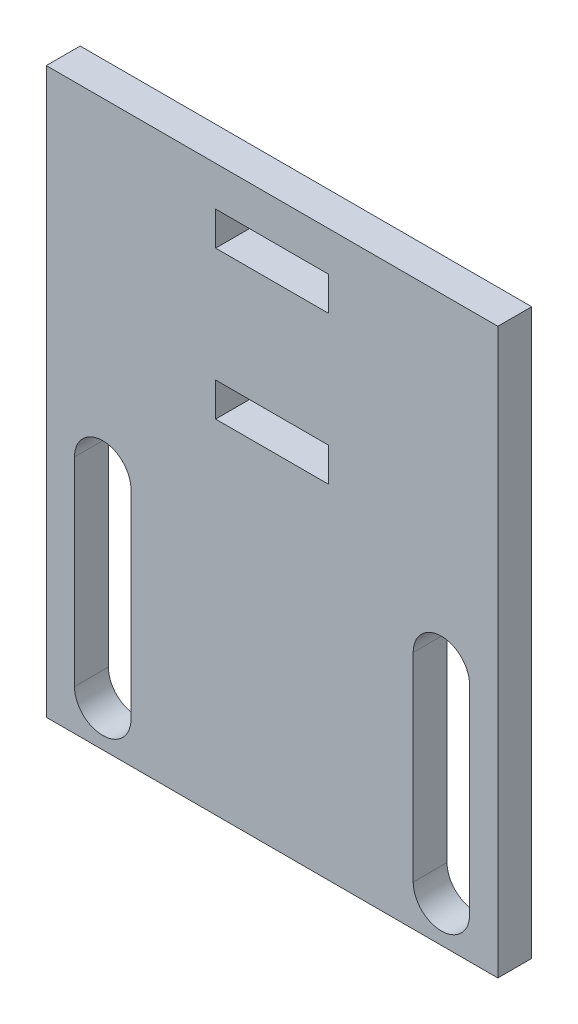
ISO-10303-21;
HEADER;
FILE_DESCRIPTION(('STEP AP214'),'2;1');
FILE_NAME('part.step','',(''),(''),'','','');
FILE_SCHEMA(('AUTOMOTIVE_DESIGN { 1 0 10303 214 1 1 1 1 }'));
ENDSEC;
DATA;
#1=APPLICATION_CONTEXT('core data for automotive mechanical design processes');
#2=APPLICATION_PROTOCOL_DEFINITION('international standard','automotive_design',2000,#1);
#3=PRODUCT_CONTEXT('',#1,'mechanical');
#4=PRODUCT('Part','Part','',(#3));
#5=PRODUCT_RELATED_PRODUCT_CATEGORY('part','',(#4));
#6=PRODUCT_DEFINITION_FORMATION('','',#4);
#7=PRODUCT_DEFINITION_CONTEXT('part definition',#1,'design');
#8=PRODUCT_DEFINITION('design','',#6,#7);
#9=PRODUCT_DEFINITION_SHAPE('','',#8);
#10=(LENGTH_UNIT() NAMED_UNIT(*) SI_UNIT(.MILLI.,.METRE.));
#11=(NAMED_UNIT(*) PLANE_ANGLE_UNIT() SI_UNIT($,.RADIAN.));
#12=(NAMED_UNIT(*) SI_UNIT($,.STERADIAN.) SOLID_ANGLE_UNIT());
#13=UNCERTAINTY_MEASURE_WITH_UNIT(LENGTH_MEASURE(1.E-05),#10,'distance_accuracy_value','');
#14=(GEOMETRIC_REPRESENTATION_CONTEXT(3) GLOBAL_UNCERTAINTY_ASSIGNED_CONTEXT((#13)) GLOBAL_UNIT_ASSIGNED_CONTEXT((#10,
#11,#12)) REPRESENTATION_CONTEXT('',''));
#15=CARTESIAN_POINT('',(0.,0.,0.));
#16=DIRECTION('',(0.,0.,1.));
#17=DIRECTION('',(1.,0.,0.));
#18=AXIS2_PLACEMENT_3D('',#15,#16,#17);
#19=CARTESIAN_POINT('',(0.,0.,3.));
#20=DIRECTION('',(0.,0.,1.));
#21=DIRECTION('',(1.,0.,0.));
#22=AXIS2_PLACEMENT_3D('',#19,#20,#21);
#23=PLANE('',#22);
#24=DIRECTION('',(0.,-1.,0.));
#25=VECTOR('',#24,1.);
#26=CARTESIAN_POINT('',(-20.,-25.,3.));
#27=LINE('',#26,#25);
#28=CARTESIAN_POINT('',(-20.,25.,3.));
#29=VERTEX_POINT('',#28);
#30=CARTESIAN_POINT('',(-20.,-25.,3.));
#31=VERTEX_POINT('',#30);
#32=EDGE_CURVE('E303',#29,#31,#27,.T.);
#33=ORIENTED_EDGE('',*,*,#32,.T.);
#34=DIRECTION('',(1.,0.,0.));
#35=VECTOR('',#34,1.);
#36=CARTESIAN_POINT('',(20.,-25.,3.));
#37=LINE('',#36,#35);
#38=CARTESIAN_POINT('',(20.,-25.,3.));
#39=VERTEX_POINT('',#38);
#40=EDGE_CURVE('E306',#31,#39,#37,.T.);
#41=ORIENTED_EDGE('',*,*,#40,.T.);
#42=DIRECTION('',(0.,1.,0.));
#43=VECTOR('',#42,1.);
#44=CARTESIAN_POINT('',(20.,-25.,3.));
#45=LINE('',#44,#43);
#46=CARTESIAN_POINT('',(20.,25.,3.));
#47=VERTEX_POINT('',#46);
#48=EDGE_CURVE('E309',#39,#47,#45,.T.);
#49=ORIENTED_EDGE('',*,*,#48,.T.);
#50=DIRECTION('',(-1.,0.,0.));
#51=VECTOR('',#50,1.);
#52=CARTESIAN_POINT('',(20.,25.,3.));
#53=LINE('',#52,#51);
#54=EDGE_CURVE('E311',#47,#29,#53,.T.);
#55=ORIENTED_EDGE('',*,*,#54,.T.);
#56=EDGE_LOOP('',(#33,#41,#49,#55));
#57=FACE_BOUND('',#56,.T.);
#58=DIRECTION('',(1.,0.,0.));
#59=VECTOR('',#58,1.);
#60=CARTESIAN_POINT('',(5.,18.4922274745727,3.));
#61=LINE('',#60,#59);
#62=CARTESIAN_POINT('',(-5.,18.4922274745727,3.));
#63=VERTEX_POINT('',#62);
#64=CARTESIAN_POINT('',(5.,18.4922274745727,3.));
#65=VERTEX_POINT('',#64);
#66=EDGE_CURVE('E274',#63,#65,#61,.T.);
#67=ORIENTED_EDGE('',*,*,#66,.F.);
#68=DIRECTION('',(0.,-1.,0.));
#69=VECTOR('',#68,1.);
#70=CARTESIAN_POINT('',(-5.,18.4922274745727,3.));
#71=LINE('',#70,#69);
#72=CARTESIAN_POINT('',(-5.,21.4922274745727,3.));
#73=VERTEX_POINT('',#72);
#74=EDGE_CURVE('E272',#73,#63,#71,.T.);
#75=ORIENTED_EDGE('',*,*,#74,.F.);
#76=DIRECTION('',(-1.,0.,0.));
#77=VECTOR('',#76,1.);
#78=CARTESIAN_POINT('',(5.,21.4922274745727,3.));
#79=LINE('',#78,#77);
#80=CARTESIAN_POINT('',(5.,21.4922274745727,3.));
#81=VERTEX_POINT('',#80);
#82=EDGE_CURVE('E280',#81,#73,#79,.T.);
#83=ORIENTED_EDGE('',*,*,#82,.F.);
#84=DIRECTION('',(0.,1.,0.));
#85=VECTOR('',#84,1.);
#86=CARTESIAN_POINT('',(5.,18.4922274745727,3.));
#87=LINE('',#86,#85);
#88=EDGE_CURVE('E277',#65,#81,#87,.T.);
#89=ORIENTED_EDGE('',*,*,#88,.F.);
#90=EDGE_LOOP('',(#67,#75,#83,#89));
#91=FACE_BOUND('',#90,.T.);
#92=DIRECTION('',(1.,0.,0.));
#93=VECTOR('',#92,1.);
#94=CARTESIAN_POINT('',(5.,5.37805132187915,3.));
#95=LINE('',#94,#93);
#96=CARTESIAN_POINT('',(-5.,5.37805132187915,3.));
#97=VERTEX_POINT('',#96);
#98=CARTESIAN_POINT('',(5.,5.37805132187915,3.));
#99=VERTEX_POINT('',#98);
#100=EDGE_CURVE('E243',#97,#99,#95,.T.);
#101=ORIENTED_EDGE('',*,*,#100,.F.);
#102=DIRECTION('',(0.,-1.,0.));
#103=VECTOR('',#102,1.);
#104=CARTESIAN_POINT('',(-5.,5.37805132187915,3.));
#105=LINE('',#104,#103);
#106=CARTESIAN_POINT('',(-5.,8.37805132187915,3.));
#107=VERTEX_POINT('',#106);
#108=EDGE_CURVE('E241',#107,#97,#105,.T.);
#109=ORIENTED_EDGE('',*,*,#108,.F.);
#110=DIRECTION('',(-1.,0.,0.));
#111=VECTOR('',#110,1.);
#112=CARTESIAN_POINT('',(5.,8.37805132187915,3.));
#113=LINE('',#112,#111);
#114=CARTESIAN_POINT('',(5.,8.37805132187915,3.));
#115=VERTEX_POINT('',#114);
#116=EDGE_CURVE('E249',#115,#107,#113,.T.);
#117=ORIENTED_EDGE('',*,*,#116,.F.);
#118=DIRECTION('',(0.,1.,0.));
#119=VECTOR('',#118,1.);
#120=CARTESIAN_POINT('',(5.,5.37805132187915,3.));
#121=LINE('',#120,#119);
#122=EDGE_CURVE('E246',#99,#115,#121,.T.);
#123=ORIENTED_EDGE('',*,*,#122,.F.);
#124=EDGE_LOOP('',(#101,#109,#117,#123));
#125=FACE_BOUND('',#124,.T.);
#126=DIRECTION('',(0.,-1.,0.));
#127=VECTOR('',#126,1.);
#128=CARTESIAN_POINT('',(12.5,-3.77530240010232,3.));
#129=LINE('',#128,#127);
#130=CARTESIAN_POINT('',(12.5,-3.77530240010232,3.));
#131=VERTEX_POINT('',#130);
#132=CARTESIAN_POINT('',(12.5,-21.3942291070509,3.));
#133=VERTEX_POINT('',#132);
#134=EDGE_CURVE('E212',#131,#133,#129,.T.);
#135=ORIENTED_EDGE('',*,*,#134,.F.);
#136=CARTESIAN_POINT('',(15.,-3.77530240010232,3.));
#137=DIRECTION('',(0.,0.,1.));
#138=DIRECTION('',(-1.,0.,0.));
#139=AXIS2_PLACEMENT_3D('',#136,#137,#138);
#140=CIRCLE('',#139,2.5);
#141=CARTESIAN_POINT('',(17.5,-3.77530240010232,3.));
#142=VERTEX_POINT('',#141);
#143=EDGE_CURVE('E210',#142,#131,#140,.T.);
#144=ORIENTED_EDGE('',*,*,#143,.F.);
#145=DIRECTION('',(0.,1.,0.));
#146=VECTOR('',#145,1.);
#147=CARTESIAN_POINT('',(17.5,-3.77530240010232,3.));
#148=LINE('',#147,#146);
#149=CARTESIAN_POINT('',(17.5,-21.3942291070509,3.));
#150=VERTEX_POINT('',#149);
#151=EDGE_CURVE('E218',#150,#142,#148,.T.);
#152=ORIENTED_EDGE('',*,*,#151,.F.);
#153=CARTESIAN_POINT('',(15.,-21.3942291070509,3.));
#154=DIRECTION('',(0.,0.,1.));
#155=DIRECTION('',(-1.,0.,0.));
#156=AXIS2_PLACEMENT_3D('',#153,#154,#155);
#157=CIRCLE('',#156,2.5);
#158=EDGE_CURVE('E215',#133,#150,#157,.T.);
#159=ORIENTED_EDGE('',*,*,#158,.F.);
#160=EDGE_LOOP('',(#135,#144,#152,#159));
#161=FACE_BOUND('',#160,.T.);
#162=DIRECTION('',(0.,-1.,0.));
#163=VECTOR('',#162,1.);
#164=CARTESIAN_POINT('',(-17.5,-3.77530240010232,3.));
#165=LINE('',#164,#163);
#166=CARTESIAN_POINT('',(-17.5,-3.77530240010232,3.));
#167=VERTEX_POINT('',#166);
#168=CARTESIAN_POINT('',(-17.5,-21.3942291070509,3.));
#169=VERTEX_POINT('',#168);
#170=EDGE_CURVE('E182',#167,#169,#165,.T.);
#171=ORIENTED_EDGE('',*,*,#170,.F.);
#172=CARTESIAN_POINT('',(-15.,-3.77530240010232,3.));
#173=DIRECTION('',(0.,0.,1.));
#174=DIRECTION('',(1.,0.,0.));
#175=AXIS2_PLACEMENT_3D('',#172,#173,#174);
#176=CIRCLE('',#175,2.5);
#177=CARTESIAN_POINT('',(-12.5,-3.77530240010232,3.));
#178=VERTEX_POINT('',#177);
#179=EDGE_CURVE('E174',#178,#167,#176,.T.);
#180=ORIENTED_EDGE('',*,*,#179,.F.);
#181=DIRECTION('',(0.,1.,0.));
#182=VECTOR('',#181,1.);
#183=CARTESIAN_POINT('',(-12.5,-3.77530240010232,3.));
#184=LINE('',#183,#182);
#185=CARTESIAN_POINT('',(-12.5,-21.3942291070509,3.));
#186=VERTEX_POINT('',#185);
#187=EDGE_CURVE('E196',#186,#178,#184,.T.);
#188=ORIENTED_EDGE('',*,*,#187,.F.);
#189=CARTESIAN_POINT('',(-15.,-21.3942291070509,3.));
#190=DIRECTION('',(0.,0.,1.));
#191=DIRECTION('',(1.,0.,0.));
#192=AXIS2_PLACEMENT_3D('',#189,#190,#191);
#193=CIRCLE('',#192,2.5);
#194=EDGE_CURVE('E194',#169,#186,#193,.T.);
#195=ORIENTED_EDGE('',*,*,#194,.F.);
#196=EDGE_LOOP('',(#171,#180,#188,#195));
#197=FACE_BOUND('',#196,.T.);
#198=ADVANCED_FACE('F37',(#57,#91,#125,#161,#197),#23,.T.);
#199=CARTESIAN_POINT('',(0.,0.,0.));
#200=DIRECTION('',(0.,0.,1.));
#201=DIRECTION('',(1.,0.,0.));
#202=AXIS2_PLACEMENT_3D('',#199,#200,#201);
#203=PLANE('',#202);
#204=CARTESIAN_POINT('',(15.,-3.77530240010232,0.));
#205=DIRECTION('',(0.,0.,1.));
#206=DIRECTION('',(-1.,0.,0.));
#207=AXIS2_PLACEMENT_3D('',#204,#205,#206);
#208=CIRCLE('',#207,2.5);
#209=CARTESIAN_POINT('',(17.5,-3.77530240010232,0.));
#210=VERTEX_POINT('',#209);
#211=CARTESIAN_POINT('',(12.5,-3.77530240010232,0.));
#212=VERTEX_POINT('',#211);
#213=EDGE_CURVE('E190',#210,#212,#208,.T.);
#214=ORIENTED_EDGE('',*,*,#213,.T.);
#215=DIRECTION('',(0.,-1.,0.));
#216=VECTOR('',#215,1.);
#217=CARTESIAN_POINT('',(12.5,-3.77530240010232,0.));
#218=LINE('',#217,#216);
#219=CARTESIAN_POINT('',(12.5,-21.3942291070509,0.));
#220=VERTEX_POINT('',#219);
#221=EDGE_CURVE('E223',#212,#220,#218,.T.);
#222=ORIENTED_EDGE('',*,*,#221,.T.);
#223=CARTESIAN_POINT('',(15.,-21.3942291070509,0.));
#224=DIRECTION('',(0.,0.,1.));
#225=DIRECTION('',(-1.,0.,0.));
#226=AXIS2_PLACEMENT_3D('',#223,#224,#225);
#227=CIRCLE('',#226,2.5);
#228=CARTESIAN_POINT('',(17.5,-21.3942291070509,0.));
#229=VERTEX_POINT('',#228);
#230=EDGE_CURVE('E226',#220,#229,#227,.T.);
#231=ORIENTED_EDGE('',*,*,#230,.T.);
#232=DIRECTION('',(0.,1.,0.));
#233=VECTOR('',#232,1.);
#234=CARTESIAN_POINT('',(17.5,-3.77530240010232,0.));
#235=LINE('',#234,#233);
#236=EDGE_CURVE('E213',#229,#210,#235,.T.);
#237=ORIENTED_EDGE('',*,*,#236,.T.);
#238=EDGE_LOOP('',(#214,#222,#231,#237));
#239=FACE_BOUND('',#238,.T.);
#240=DIRECTION('',(0.,-1.,0.));
#241=VECTOR('',#240,1.);
#242=CARTESIAN_POINT('',(-5.,18.4922274745727,0.));
#243=LINE('',#242,#241);
#244=CARTESIAN_POINT('',(-5.,21.4922274745727,0.));
#245=VERTEX_POINT('',#244);
#246=CARTESIAN_POINT('',(-5.,18.4922274745727,0.));
#247=VERTEX_POINT('',#246);
#248=EDGE_CURVE('E271',#245,#247,#243,.T.);
#249=ORIENTED_EDGE('',*,*,#248,.T.);
#250=DIRECTION('',(1.,0.,0.));
#251=VECTOR('',#250,1.);
#252=CARTESIAN_POINT('',(5.,18.4922274745727,0.));
#253=LINE('',#252,#251);
#254=CARTESIAN_POINT('',(5.,18.4922274745727,0.));
#255=VERTEX_POINT('',#254);
#256=EDGE_CURVE('E285',#247,#255,#253,.T.);
#257=ORIENTED_EDGE('',*,*,#256,.T.);
#258=DIRECTION('',(0.,1.,0.));
#259=VECTOR('',#258,1.);
#260=CARTESIAN_POINT('',(5.,18.4922274745727,0.));
#261=LINE('',#260,#259);
#262=CARTESIAN_POINT('',(5.,21.4922274745727,0.));
#263=VERTEX_POINT('',#262);
#264=EDGE_CURVE('E288',#255,#263,#261,.T.);
#265=ORIENTED_EDGE('',*,*,#264,.T.);
#266=DIRECTION('',(-1.,0.,0.));
#267=VECTOR('',#266,1.);
#268=CARTESIAN_POINT('',(5.,21.4922274745727,0.));
#269=LINE('',#268,#267);
#270=EDGE_CURVE('E275',#263,#245,#269,.T.);
#271=ORIENTED_EDGE('',*,*,#270,.T.);
#272=EDGE_LOOP('',(#249,#257,#265,#271));
#273=FACE_BOUND('',#272,.T.);
#274=DIRECTION('',(0.,-1.,0.));
#275=VECTOR('',#274,1.);
#276=CARTESIAN_POINT('',(-20.,-25.,0.));
#277=LINE('',#276,#275);
#278=CARTESIAN_POINT('',(-20.,25.,0.));
#279=VERTEX_POINT('',#278);
#280=CARTESIAN_POINT('',(-20.,-25.,0.));
#281=VERTEX_POINT('',#280);
#282=EDGE_CURVE('E302',#279,#281,#277,.T.);
#283=ORIENTED_EDGE('',*,*,#282,.F.);
#284=DIRECTION('',(-1.,0.,0.));
#285=VECTOR('',#284,1.);
#286=CARTESIAN_POINT('',(20.,25.,0.));
#287=LINE('',#286,#285);
#288=CARTESIAN_POINT('',(20.,25.,0.));
#289=VERTEX_POINT('',#288);
#290=EDGE_CURVE('E307',#289,#279,#287,.T.);
#291=ORIENTED_EDGE('',*,*,#290,.F.);
#292=DIRECTION('',(0.,1.,0.));
#293=VECTOR('',#292,1.);
#294=CARTESIAN_POINT('',(20.,-25.,0.));
#295=LINE('',#294,#293);
#296=CARTESIAN_POINT('',(20.,-25.,0.));
#297=VERTEX_POINT('',#296);
#298=EDGE_CURVE('E318',#297,#289,#295,.T.);
#299=ORIENTED_EDGE('',*,*,#298,.F.);
#300=DIRECTION('',(1.,0.,0.));
#301=VECTOR('',#300,1.);
#302=CARTESIAN_POINT('',(20.,-25.,0.));
#303=LINE('',#302,#301);
#304=EDGE_CURVE('E316',#281,#297,#303,.T.);
#305=ORIENTED_EDGE('',*,*,#304,.F.);
#306=EDGE_LOOP('',(#283,#291,#299,#305));
#307=FACE_BOUND('',#306,.T.);
#308=DIRECTION('',(0.,-1.,0.));
#309=VECTOR('',#308,1.);
#310=CARTESIAN_POINT('',(-5.,5.37805132187915,0.));
#311=LINE('',#310,#309);
#312=CARTESIAN_POINT('',(-5.,8.37805132187915,0.));
#313=VERTEX_POINT('',#312);
#314=CARTESIAN_POINT('',(-5.,5.37805132187915,0.));
#315=VERTEX_POINT('',#314);
#316=EDGE_CURVE('E240',#313,#315,#311,.T.);
#317=ORIENTED_EDGE('',*,*,#316,.T.);
#318=DIRECTION('',(1.,0.,0.));
#319=VECTOR('',#318,1.);
#320=CARTESIAN_POINT('',(5.,5.37805132187915,0.));
#321=LINE('',#320,#319);
#322=CARTESIAN_POINT('',(5.,5.37805132187915,0.));
#323=VERTEX_POINT('',#322);
#324=EDGE_CURVE('E254',#315,#323,#321,.T.);
#325=ORIENTED_EDGE('',*,*,#324,.T.);
#326=DIRECTION('',(0.,1.,0.));
#327=VECTOR('',#326,1.);
#328=CARTESIAN_POINT('',(5.,5.37805132187915,0.));
#329=LINE('',#328,#327);
#330=CARTESIAN_POINT('',(5.,8.37805132187915,0.));
#331=VERTEX_POINT('',#330);
#332=EDGE_CURVE('E257',#323,#331,#329,.T.);
#333=ORIENTED_EDGE('',*,*,#332,.T.);
#334=DIRECTION('',(-1.,0.,0.));
#335=VECTOR('',#334,1.);
#336=CARTESIAN_POINT('',(5.,8.37805132187915,0.));
#337=LINE('',#336,#335);
#338=EDGE_CURVE('E244',#331,#313,#337,.T.);
#339=ORIENTED_EDGE('',*,*,#338,.T.);
#340=EDGE_LOOP('',(#317,#325,#333,#339));
#341=FACE_BOUND('',#340,.T.);
#342=CARTESIAN_POINT('',(-15.,-3.77530240010232,0.));
#343=DIRECTION('',(0.,0.,1.));
#344=DIRECTION('',(1.,0.,0.));
#345=AXIS2_PLACEMENT_3D('',#342,#343,#344);
#346=CIRCLE('',#345,2.5);
#347=CARTESIAN_POINT('',(-12.5,-3.77530240010232,0.));
#348=VERTEX_POINT('',#347);
#349=CARTESIAN_POINT('',(-17.5,-3.77530240010232,0.));
#350=VERTEX_POINT('',#349);
#351=EDGE_CURVE('E60',#348,#350,#346,.T.);
#352=ORIENTED_EDGE('',*,*,#351,.T.);
#353=DIRECTION('',(0.,-1.,0.));
#354=VECTOR('',#353,1.);
#355=CARTESIAN_POINT('',(-17.5,-3.77530240010232,0.));
#356=LINE('',#355,#354);
#357=CARTESIAN_POINT('',(-17.5,-21.3942291070509,0.));
#358=VERTEX_POINT('',#357);
#359=EDGE_CURVE('E189',#350,#358,#356,.T.);
#360=ORIENTED_EDGE('',*,*,#359,.T.);
#361=CARTESIAN_POINT('',(-15.,-21.3942291070509,0.));
#362=DIRECTION('',(0.,0.,1.));
#363=DIRECTION('',(1.,0.,0.));
#364=AXIS2_PLACEMENT_3D('',#361,#362,#363);
#365=CIRCLE('',#364,2.5);
#366=CARTESIAN_POINT('',(-12.5,-21.3942291070509,0.));
#367=VERTEX_POINT('',#366);
#368=EDGE_CURVE('E202',#358,#367,#365,.T.);
#369=ORIENTED_EDGE('',*,*,#368,.T.);
#370=DIRECTION('',(0.,1.,0.));
#371=VECTOR('',#370,1.);
#372=CARTESIAN_POINT('',(-12.5,-3.77530240010232,0.));
#373=LINE('',#372,#371);
#374=EDGE_CURVE('E183',#367,#348,#373,.T.);
#375=ORIENTED_EDGE('',*,*,#374,.T.);
#376=EDGE_LOOP('',(#352,#360,#369,#375));
#377=FACE_BOUND('',#376,.T.);
#378=ADVANCED_FACE('F336',(#239,#273,#307,#341,#377),#203,.F.);
#379=CARTESIAN_POINT('',(-20.,-25.,3.));
#380=DIRECTION('',(1.,0.,0.));
#381=DIRECTION('',(0.,0.,-1.));
#382=AXIS2_PLACEMENT_3D('',#379,#380,#381);
#383=PLANE('',#382);
#384=ORIENTED_EDGE('',*,*,#282,.T.);
#385=DIRECTION('',(0.,0.,-1.));
#386=VECTOR('',#385,1.);
#387=CARTESIAN_POINT('',(-20.,-25.,3.));
#388=LINE('',#387,#386);
#389=EDGE_CURVE('E11',#31,#281,#388,.T.);
#390=ORIENTED_EDGE('',*,*,#389,.F.);
#391=ORIENTED_EDGE('',*,*,#32,.F.);
#392=DIRECTION('',(0.,0.,-1.));
#393=VECTOR('',#392,1.);
#394=CARTESIAN_POINT('',(-20.,25.,3.));
#395=LINE('',#394,#393);
#396=EDGE_CURVE('E313',#29,#279,#395,.T.);
#397=ORIENTED_EDGE('',*,*,#396,.T.);
#398=EDGE_LOOP('',(#384,#390,#391,#397));
#399=FACE_BOUND('',#398,.T.);
#400=ADVANCED_FACE('F39',(#399),#383,.F.);
#401=CARTESIAN_POINT('',(20.,-25.,3.));
#402=DIRECTION('',(0.,1.,0.));
#403=DIRECTION('',(-1.,0.,0.));
#404=AXIS2_PLACEMENT_3D('',#401,#402,#403);
#405=PLANE('',#404);
#406=ORIENTED_EDGE('',*,*,#304,.T.);
#407=DIRECTION('',(0.,0.,-1.));
#408=VECTOR('',#407,1.);
#409=CARTESIAN_POINT('',(20.,-25.,3.));
#410=LINE('',#409,#408);
#411=EDGE_CURVE('E45',#39,#297,#410,.T.);
#412=ORIENTED_EDGE('',*,*,#411,.F.);
#413=ORIENTED_EDGE('',*,*,#40,.F.);
#414=ORIENTED_EDGE('',*,*,#389,.T.);
#415=EDGE_LOOP('',(#406,#412,#413,#414));
#416=FACE_BOUND('',#415,.T.);
#417=ADVANCED_FACE('F347',(#416),#405,.F.);
#418=CARTESIAN_POINT('',(20.,-25.,3.));
#419=DIRECTION('',(-1.,0.,0.));
#420=DIRECTION('',(0.,0.,1.));
#421=AXIS2_PLACEMENT_3D('',#418,#419,#420);
#422=PLANE('',#421);
#423=ORIENTED_EDGE('',*,*,#298,.T.);
#424=DIRECTION('',(0.,0.,-1.));
#425=VECTOR('',#424,1.);
#426=CARTESIAN_POINT('',(20.,25.,3.));
#427=LINE('',#426,#425);
#428=EDGE_CURVE('E323',#47,#289,#427,.T.);
#429=ORIENTED_EDGE('',*,*,#428,.F.);
#430=ORIENTED_EDGE('',*,*,#48,.F.);
#431=ORIENTED_EDGE('',*,*,#411,.T.);
#432=EDGE_LOOP('',(#423,#429,#430,#431));
#433=FACE_BOUND('',#432,.T.);
#434=ADVANCED_FACE('F330',(#433),#422,.F.);
#435=CARTESIAN_POINT('',(20.,25.,3.));
#436=DIRECTION('',(0.,-1.,0.));
#437=DIRECTION('',(1.,0.,0.));
#438=AXIS2_PLACEMENT_3D('',#435,#436,#437);
#439=PLANE('',#438);
#440=ORIENTED_EDGE('',*,*,#290,.T.);
#441=ORIENTED_EDGE('',*,*,#396,.F.);
#442=ORIENTED_EDGE('',*,*,#54,.F.);
#443=ORIENTED_EDGE('',*,*,#428,.T.);
#444=EDGE_LOOP('',(#440,#441,#442,#443));
#445=FACE_BOUND('',#444,.T.);
#446=ADVANCED_FACE('F340',(#445),#439,.F.);
#447=CARTESIAN_POINT('',(-5.,18.4922274745727,3.));
#448=DIRECTION('',(1.,0.,0.));
#449=DIRECTION('',(0.,0.,-1.));
#450=AXIS2_PLACEMENT_3D('',#447,#448,#449);
#451=PLANE('',#450);
#452=ORIENTED_EDGE('',*,*,#248,.F.);
#453=DIRECTION('',(0.,0.,-1.));
#454=VECTOR('',#453,1.);
#455=CARTESIAN_POINT('',(-5.,21.4922274745727,3.));
#456=LINE('',#455,#454);
#457=EDGE_CURVE('E282',#73,#245,#456,.T.);
#458=ORIENTED_EDGE('',*,*,#457,.F.);
#459=ORIENTED_EDGE('',*,*,#74,.T.);
#460=DIRECTION('',(0.,0.,-1.));
#461=VECTOR('',#460,1.);
#462=CARTESIAN_POINT('',(-5.,18.4922274745727,3.));
#463=LINE('',#462,#461);
#464=EDGE_CURVE('E299',#63,#247,#463,.T.);
#465=ORIENTED_EDGE('',*,*,#464,.T.);
#466=EDGE_LOOP('',(#452,#458,#459,#465));
#467=FACE_BOUND('',#466,.T.);
#468=ADVANCED_FACE('F362',(#467),#451,.T.);
#469=CARTESIAN_POINT('',(5.,18.4922274745727,3.));
#470=DIRECTION('',(0.,1.,0.));
#471=DIRECTION('',(0.,0.,1.));
#472=AXIS2_PLACEMENT_3D('',#469,#470,#471);
#473=PLANE('',#472);
#474=ORIENTED_EDGE('',*,*,#256,.F.);
#475=ORIENTED_EDGE('',*,*,#464,.F.);
#476=ORIENTED_EDGE('',*,*,#66,.T.);
#477=DIRECTION('',(0.,0.,-1.));
#478=VECTOR('',#477,1.);
#479=CARTESIAN_POINT('',(5.,18.4922274745727,3.));
#480=LINE('',#479,#478);
#481=EDGE_CURVE('E297',#65,#255,#480,.T.);
#482=ORIENTED_EDGE('',*,*,#481,.T.);
#483=EDGE_LOOP('',(#474,#475,#476,#482));
#484=FACE_BOUND('',#483,.T.);
#485=ADVANCED_FACE('F369',(#484),#473,.T.);
#486=CARTESIAN_POINT('',(5.,18.4922274745727,3.));
#487=DIRECTION('',(-1.,0.,0.));
#488=DIRECTION('',(0.,0.,1.));
#489=AXIS2_PLACEMENT_3D('',#486,#487,#488);
#490=PLANE('',#489);
#491=ORIENTED_EDGE('',*,*,#264,.F.);
#492=ORIENTED_EDGE('',*,*,#481,.F.);
#493=ORIENTED_EDGE('',*,*,#88,.T.);
#494=DIRECTION('',(0.,0.,-1.));
#495=VECTOR('',#494,1.);
#496=CARTESIAN_POINT('',(5.,21.4922274745727,3.));
#497=LINE('',#496,#495);
#498=EDGE_CURVE('E295',#81,#263,#497,.T.);
#499=ORIENTED_EDGE('',*,*,#498,.T.);
#500=EDGE_LOOP('',(#491,#492,#493,#499));
#501=FACE_BOUND('',#500,.T.);
#502=ADVANCED_FACE('F374',(#501),#490,.T.);
#503=CARTESIAN_POINT('',(5.,21.4922274745727,3.));
#504=DIRECTION('',(0.,-1.,0.));
#505=DIRECTION('',(0.,0.,-1.));
#506=AXIS2_PLACEMENT_3D('',#503,#504,#505);
#507=PLANE('',#506);
#508=ORIENTED_EDGE('',*,*,#270,.F.);
#509=ORIENTED_EDGE('',*,*,#498,.F.);
#510=ORIENTED_EDGE('',*,*,#82,.T.);
#511=ORIENTED_EDGE('',*,*,#457,.T.);
#512=EDGE_LOOP('',(#508,#509,#510,#511));
#513=FACE_BOUND('',#512,.T.);
#514=ADVANCED_FACE('F382',(#513),#507,.T.);
#515=CARTESIAN_POINT('',(-5.,5.37805132187915,3.));
#516=DIRECTION('',(1.,0.,0.));
#517=DIRECTION('',(0.,1.,0.));
#518=AXIS2_PLACEMENT_3D('',#515,#516,#517);
#519=PLANE('',#518);
#520=ORIENTED_EDGE('',*,*,#316,.F.);
#521=DIRECTION('',(0.,0.,-1.));
#522=VECTOR('',#521,1.);
#523=CARTESIAN_POINT('',(-5.,8.37805132187915,3.));
#524=LINE('',#523,#522);
#525=EDGE_CURVE('E251',#107,#313,#524,.T.);
#526=ORIENTED_EDGE('',*,*,#525,.F.);
#527=ORIENTED_EDGE('',*,*,#108,.T.);
#528=DIRECTION('',(0.,0.,-1.));
#529=VECTOR('',#528,1.);
#530=CARTESIAN_POINT('',(-5.,5.37805132187915,3.));
#531=LINE('',#530,#529);
#532=EDGE_CURVE('E268',#97,#315,#531,.T.);
#533=ORIENTED_EDGE('',*,*,#532,.T.);
#534=EDGE_LOOP('',(#520,#526,#527,#533));
#535=FACE_BOUND('',#534,.T.);
#536=ADVANCED_FACE('F436',(#535),#519,.T.);
#537=CARTESIAN_POINT('',(5.,5.37805132187915,3.));
#538=DIRECTION('',(0.,1.,0.));
#539=DIRECTION('',(-1.,0.,0.));
#540=AXIS2_PLACEMENT_3D('',#537,#538,#539);
#541=PLANE('',#540);
#542=ORIENTED_EDGE('',*,*,#324,.F.);
#543=ORIENTED_EDGE('',*,*,#532,.F.);
#544=ORIENTED_EDGE('',*,*,#100,.T.);
#545=DIRECTION('',(0.,0.,-1.));
#546=VECTOR('',#545,1.);
#547=CARTESIAN_POINT('',(5.,5.37805132187915,3.));
#548=LINE('',#547,#546);
#549=EDGE_CURVE('E266',#99,#323,#548,.T.);
#550=ORIENTED_EDGE('',*,*,#549,.T.);
#551=EDGE_LOOP('',(#542,#543,#544,#550));
#552=FACE_BOUND('',#551,.T.);
#553=ADVANCED_FACE('F432',(#552),#541,.T.);
#554=CARTESIAN_POINT('',(5.,5.37805132187915,3.));
#555=DIRECTION('',(-1.,0.,0.));
#556=DIRECTION('',(0.,0.,1.));
#557=AXIS2_PLACEMENT_3D('',#554,#555,#556);
#558=PLANE('',#557);
#559=ORIENTED_EDGE('',*,*,#332,.F.);
#560=ORIENTED_EDGE('',*,*,#549,.F.);
#561=ORIENTED_EDGE('',*,*,#122,.T.);
#562=DIRECTION('',(0.,0.,-1.));
#563=VECTOR('',#562,1.);
#564=CARTESIAN_POINT('',(5.,8.37805132187915,3.));
#565=LINE('',#564,#563);
#566=EDGE_CURVE('E264',#115,#331,#565,.T.);
#567=ORIENTED_EDGE('',*,*,#566,.T.);
#568=EDGE_LOOP('',(#559,#560,#561,#567));
#569=FACE_BOUND('',#568,.T.);
#570=ADVANCED_FACE('F428',(#569),#558,.T.);
#571=CARTESIAN_POINT('',(5.,8.37805132187915,3.));
#572=DIRECTION('',(0.,-1.,0.));
#573=DIRECTION('',(1.,0.,0.));
#574=AXIS2_PLACEMENT_3D('',#571,#572,#573);
#575=PLANE('',#574);
#576=ORIENTED_EDGE('',*,*,#338,.F.);
#577=ORIENTED_EDGE('',*,*,#566,.F.);
#578=ORIENTED_EDGE('',*,*,#116,.T.);
#579=ORIENTED_EDGE('',*,*,#525,.T.);
#580=EDGE_LOOP('',(#576,#577,#578,#579));
#581=FACE_BOUND('',#580,.T.);
#582=ADVANCED_FACE('F425',(#581),#575,.T.);
#583=CARTESIAN_POINT('',(15.,-3.77530240010232,3.));
#584=DIRECTION('',(0.,0.,-1.));
#585=DIRECTION('',(-1.,0.,0.));
#586=AXIS2_PLACEMENT_3D('',#583,#584,#585);
#587=CYLINDRICAL_SURFACE('',#586,2.5);
#588=ORIENTED_EDGE('',*,*,#213,.F.);
#589=DIRECTION('',(0.,0.,-1.));
#590=VECTOR('',#589,1.);
#591=CARTESIAN_POINT('',(17.5,-3.77530240010232,3.));
#592=LINE('',#591,#590);
#593=EDGE_CURVE('E220',#142,#210,#592,.T.);
#594=ORIENTED_EDGE('',*,*,#593,.F.);
#595=ORIENTED_EDGE('',*,*,#143,.T.);
#596=DIRECTION('',(0.,0.,-1.));
#597=VECTOR('',#596,1.);
#598=CARTESIAN_POINT('',(12.5,-3.77530240010232,3.));
#599=LINE('',#598,#597);
#600=EDGE_CURVE('E237',#131,#212,#599,.T.);
#601=ORIENTED_EDGE('',*,*,#600,.T.);
#602=EDGE_LOOP('',(#588,#594,#595,#601));
#603=FACE_BOUND('',#602,.T.);
#604=ADVANCED_FACE('F407',(#603),#587,.F.);
#605=CARTESIAN_POINT('',(12.5,-3.77530240010232,3.));
#606=DIRECTION('',(1.,0.,0.));
#607=DIRECTION('',(0.,1.,0.));
#608=AXIS2_PLACEMENT_3D('',#605,#606,#607);
#609=PLANE('',#608);
#610=ORIENTED_EDGE('',*,*,#221,.F.);
#611=ORIENTED_EDGE('',*,*,#600,.F.);
#612=ORIENTED_EDGE('',*,*,#134,.T.);
#613=DIRECTION('',(0.,0.,-1.));
#614=VECTOR('',#613,1.);
#615=CARTESIAN_POINT('',(12.5,-21.3942291070509,3.));
#616=LINE('',#615,#614);
#617=EDGE_CURVE('E235',#133,#220,#616,.T.);
#618=ORIENTED_EDGE('',*,*,#617,.T.);
#619=EDGE_LOOP('',(#610,#611,#612,#618));
#620=FACE_BOUND('',#619,.T.);
#621=ADVANCED_FACE('F401',(#620),#609,.T.);
#622=CARTESIAN_POINT('',(15.,-21.3942291070509,3.));
#623=DIRECTION('',(0.,0.,-1.));
#624=DIRECTION('',(-1.,0.,0.));
#625=AXIS2_PLACEMENT_3D('',#622,#623,#624);
#626=CYLINDRICAL_SURFACE('',#625,2.5);
#627=ORIENTED_EDGE('',*,*,#230,.F.);
#628=ORIENTED_EDGE('',*,*,#617,.F.);
#629=ORIENTED_EDGE('',*,*,#158,.T.);
#630=DIRECTION('',(0.,0.,-1.));
#631=VECTOR('',#630,1.);
#632=CARTESIAN_POINT('',(17.5,-21.3942291070509,3.));
#633=LINE('',#632,#631);
#634=EDGE_CURVE('E233',#150,#229,#633,.T.);
#635=ORIENTED_EDGE('',*,*,#634,.T.);
#636=EDGE_LOOP('',(#627,#628,#629,#635));
#637=FACE_BOUND('',#636,.T.);
#638=ADVANCED_FACE('F404',(#637),#626,.F.);
#639=CARTESIAN_POINT('',(17.5,-3.77530240010232,3.));
#640=DIRECTION('',(-1.,0.,0.));
#641=DIRECTION('',(0.,-1.,0.));
#642=AXIS2_PLACEMENT_3D('',#639,#640,#641);
#643=PLANE('',#642);
#644=ORIENTED_EDGE('',*,*,#236,.F.);
#645=ORIENTED_EDGE('',*,*,#634,.F.);
#646=ORIENTED_EDGE('',*,*,#151,.T.);
#647=ORIENTED_EDGE('',*,*,#593,.T.);
#648=EDGE_LOOP('',(#644,#645,#646,#647));
#649=FACE_BOUND('',#648,.T.);
#650=ADVANCED_FACE('F410',(#649),#643,.T.);
#651=CARTESIAN_POINT('',(-15.,-3.77530240010232,3.));
#652=DIRECTION('',(0.,0.,-1.));
#653=DIRECTION('',(-1.,0.,0.));
#654=AXIS2_PLACEMENT_3D('',#651,#652,#653);
#655=CYLINDRICAL_SURFACE('',#654,2.5);
#656=ORIENTED_EDGE('',*,*,#351,.F.);
#657=DIRECTION('',(0.,0.,-1.));
#658=VECTOR('',#657,1.);
#659=CARTESIAN_POINT('',(-12.5,-3.77530240010232,3.));
#660=LINE('',#659,#658);
#661=EDGE_CURVE('E178',#178,#348,#660,.T.);
#662=ORIENTED_EDGE('',*,*,#661,.F.);
#663=ORIENTED_EDGE('',*,*,#179,.T.);
#664=DIRECTION('',(0.,0.,-1.));
#665=VECTOR('',#664,1.);
#666=CARTESIAN_POINT('',(-17.5,-3.77530240010232,3.));
#667=LINE('',#666,#665);
#668=EDGE_CURVE('E177',#167,#350,#667,.T.);
#669=ORIENTED_EDGE('',*,*,#668,.T.);
#670=EDGE_LOOP('',(#656,#662,#663,#669));
#671=FACE_BOUND('',#670,.T.);
#672=ADVANCED_FACE('F176',(#671),#655,.F.);
#673=CARTESIAN_POINT('',(-17.5,-3.77530240010232,3.));
#674=DIRECTION('',(1.,0.,0.));
#675=DIRECTION('',(0.,0.,-1.));
#676=AXIS2_PLACEMENT_3D('',#673,#674,#675);
#677=PLANE('',#676);
#678=ORIENTED_EDGE('',*,*,#359,.F.);
#679=ORIENTED_EDGE('',*,*,#668,.F.);
#680=ORIENTED_EDGE('',*,*,#170,.T.);
#681=DIRECTION('',(0.,0.,-1.));
#682=VECTOR('',#681,1.);
#683=CARTESIAN_POINT('',(-17.5,-21.3942291070509,3.));
#684=LINE('',#683,#682);
#685=EDGE_CURVE('E191',#169,#358,#684,.T.);
#686=ORIENTED_EDGE('',*,*,#685,.T.);
#687=EDGE_LOOP('',(#678,#679,#680,#686));
#688=FACE_BOUND('',#687,.T.);
#689=ADVANCED_FACE('F186',(#688),#677,.T.);
#690=CARTESIAN_POINT('',(-15.,-21.3942291070509,3.));
#691=DIRECTION('',(0.,0.,-1.));
#692=DIRECTION('',(-1.,0.,0.));
#693=AXIS2_PLACEMENT_3D('',#690,#691,#692);
#694=CYLINDRICAL_SURFACE('',#693,2.5);
#695=ORIENTED_EDGE('',*,*,#368,.F.);
#696=ORIENTED_EDGE('',*,*,#685,.F.);
#697=ORIENTED_EDGE('',*,*,#194,.T.);
#698=DIRECTION('',(0.,0.,-1.));
#699=VECTOR('',#698,1.);
#700=CARTESIAN_POINT('',(-12.5,-21.3942291070509,3.));
#701=LINE('',#700,#699);
#702=EDGE_CURVE('E52',#186,#367,#701,.T.);
#703=ORIENTED_EDGE('',*,*,#702,.T.);
#704=EDGE_LOOP('',(#695,#696,#697,#703));
#705=FACE_BOUND('',#704,.T.);
#706=ADVANCED_FACE('F499',(#705),#694,.F.);
#707=CARTESIAN_POINT('',(-12.5,-3.77530240010232,3.));
#708=DIRECTION('',(-1.,0.,0.));
#709=DIRECTION('',(0.,-1.,0.));
#710=AXIS2_PLACEMENT_3D('',#707,#708,#709);
#711=PLANE('',#710);
#712=ORIENTED_EDGE('',*,*,#374,.F.);
#713=ORIENTED_EDGE('',*,*,#702,.F.);
#714=ORIENTED_EDGE('',*,*,#187,.T.);
#715=ORIENTED_EDGE('',*,*,#661,.T.);
#716=EDGE_LOOP('',(#712,#713,#714,#715));
#717=FACE_BOUND('',#716,.T.);
#718=ADVANCED_FACE('F507',(#717),#711,.T.);
#719=CLOSED_SHELL('',(#198,#378,#400,#417,#434,#446,#468,#485,#502,#514,#536,#553,#570,#582,
#604,#621,#638,#650,#672,#689,#706,#718));
#720=MANIFOLD_SOLID_BREP('B2',#719);
#721=ADVANCED_BREP_SHAPE_REPRESENTATION('',(#18,#720),#14);
#722=SHAPE_DEFINITION_REPRESENTATION(#9,#721);
ENDSEC;
END-ISO-10303-21;
